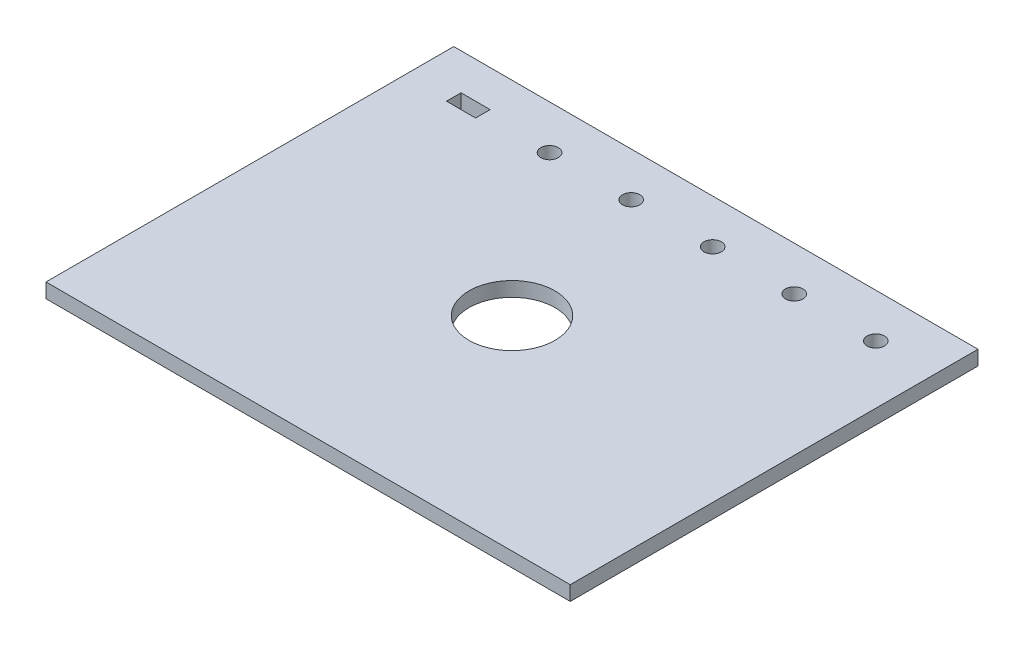
ISO-10303-21;
HEADER;
FILE_DESCRIPTION(('STEP AP214'),'2;1');
FILE_NAME('part.step','',(''),(''),'','','');
FILE_SCHEMA(('AUTOMOTIVE_DESIGN { 1 0 10303 214 1 1 1 1 }'));
ENDSEC;
DATA;
#1=APPLICATION_CONTEXT('core data for automotive mechanical design processes');
#2=APPLICATION_PROTOCOL_DEFINITION('international standard','automotive_design',2000,#1);
#3=PRODUCT_CONTEXT('',#1,'mechanical');
#4=PRODUCT('Part','Part','',(#3));
#5=PRODUCT_RELATED_PRODUCT_CATEGORY('part','',(#4));
#6=PRODUCT_DEFINITION_FORMATION('','',#4);
#7=PRODUCT_DEFINITION_CONTEXT('part definition',#1,'design');
#8=PRODUCT_DEFINITION('design','',#6,#7);
#9=PRODUCT_DEFINITION_SHAPE('','',#8);
#10=(LENGTH_UNIT() NAMED_UNIT(*) SI_UNIT(.MILLI.,.METRE.));
#11=(NAMED_UNIT(*) PLANE_ANGLE_UNIT() SI_UNIT($,.RADIAN.));
#12=(NAMED_UNIT(*) SI_UNIT($,.STERADIAN.) SOLID_ANGLE_UNIT());
#13=UNCERTAINTY_MEASURE_WITH_UNIT(LENGTH_MEASURE(1.E-05),#10,'distance_accuracy_value','');
#14=(GEOMETRIC_REPRESENTATION_CONTEXT(3) GLOBAL_UNCERTAINTY_ASSIGNED_CONTEXT((#13)) GLOBAL_UNIT_ASSIGNED_CONTEXT((#10,
#11,#12)) REPRESENTATION_CONTEXT('',''));
#15=CARTESIAN_POINT('',(0.,0.,0.));
#16=DIRECTION('',(0.,0.,1.));
#17=DIRECTION('',(1.,0.,0.));
#18=AXIS2_PLACEMENT_3D('',#15,#16,#17);
#19=CARTESIAN_POINT('',(0.,5.,0.));
#20=DIRECTION('',(0.,-1.,0.));
#21=DIRECTION('',(0.,0.,-1.));
#22=AXIS2_PLACEMENT_3D('',#19,#20,#21);
#23=PLANE('',#22);
#24=CARTESIAN_POINT('',(-42.,5.,-54.8950795947902));
#25=DIRECTION('',(0.,1.,0.));
#26=DIRECTION('',(0.,0.,1.));
#27=AXIS2_PLACEMENT_3D('',#24,#25,#26);
#28=CIRCLE('',#27,3.);
#29=CARTESIAN_POINT('',(-42.,5.,-51.8950795947902));
#30=VERTEX_POINT('',#29);
#31=EDGE_CURVE('E134',#30,#30,#28,.T.);
#32=ORIENTED_EDGE('',*,*,#31,.F.);
#33=EDGE_LOOP('',(#32));
#34=FACE_BOUND('',#33,.T.);
#35=CARTESIAN_POINT('',(-14.,5.,-54.8950795947902));
#36=DIRECTION('',(0.,1.,0.));
#37=DIRECTION('',(0.,0.,1.));
#38=AXIS2_PLACEMENT_3D('',#35,#36,#37);
#39=CIRCLE('',#38,3.);
#40=CARTESIAN_POINT('',(-14.,5.,-51.8950795947902));
#41=VERTEX_POINT('',#40);
#42=EDGE_CURVE('E140',#41,#41,#39,.T.);
#43=ORIENTED_EDGE('',*,*,#42,.F.);
#44=EDGE_LOOP('',(#43));
#45=FACE_BOUND('',#44,.T.);
#46=CARTESIAN_POINT('',(14.,5.,-54.8950795947902));
#47=DIRECTION('',(0.,1.,0.));
#48=DIRECTION('',(0.,0.,1.));
#49=AXIS2_PLACEMENT_3D('',#46,#47,#48);
#50=CIRCLE('',#49,3.);
#51=CARTESIAN_POINT('',(14.,5.,-51.8950795947902));
#52=VERTEX_POINT('',#51);
#53=EDGE_CURVE('E146',#52,#52,#50,.T.);
#54=ORIENTED_EDGE('',*,*,#53,.F.);
#55=EDGE_LOOP('',(#54));
#56=FACE_BOUND('',#55,.T.);
#57=CARTESIAN_POINT('',(42.,5.,-54.8950795947903));
#58=DIRECTION('',(0.,1.,0.));
#59=DIRECTION('',(0.,0.,1.));
#60=AXIS2_PLACEMENT_3D('',#57,#58,#59);
#61=CIRCLE('',#60,3.);
#62=CARTESIAN_POINT('',(42.,5.,-51.8950795947903));
#63=VERTEX_POINT('',#62);
#64=EDGE_CURVE('E152',#63,#63,#61,.T.);
#65=ORIENTED_EDGE('',*,*,#64,.F.);
#66=EDGE_LOOP('',(#65));
#67=FACE_BOUND('',#66,.T.);
#68=CARTESIAN_POINT('',(70.,5.,-54.8950795947903));
#69=DIRECTION('',(0.,1.,0.));
#70=DIRECTION('',(0.,0.,1.));
#71=AXIS2_PLACEMENT_3D('',#68,#69,#70);
#72=CIRCLE('',#71,3.00000000000001);
#73=CARTESIAN_POINT('',(70.,5.,-51.8950795947903));
#74=VERTEX_POINT('',#73);
#75=EDGE_CURVE('E158',#74,#74,#72,.T.);
#76=ORIENTED_EDGE('',*,*,#75,.F.);
#77=EDGE_LOOP('',(#76));
#78=FACE_BOUND('',#77,.T.);
#79=CARTESIAN_POINT('',(0.,5.,0.));
#80=DIRECTION('',(0.,1.,0.));
#81=DIRECTION('',(0.,0.,1.));
#82=AXIS2_PLACEMENT_3D('',#79,#80,#81);
#83=CIRCLE('',#82,14.75);
#84=CARTESIAN_POINT('',(0.,5.,14.75));
#85=VERTEX_POINT('',#84);
#86=EDGE_CURVE('E164',#85,#85,#83,.T.);
#87=ORIENTED_EDGE('',*,*,#86,.F.);
#88=EDGE_LOOP('',(#87));
#89=FACE_BOUND('',#88,.T.);
#90=DIRECTION('',(0.,0.,-1.));
#91=VECTOR('',#90,1.);
#92=CARTESIAN_POINT('',(90.,5.,70.));
#93=LINE('',#92,#91);
#94=CARTESIAN_POINT('',(90.,5.,70.));
#95=VERTEX_POINT('',#94);
#96=CARTESIAN_POINT('',(90.,5.,-70.));
#97=VERTEX_POINT('',#96);
#98=EDGE_CURVE('E170',#95,#97,#93,.T.);
#99=ORIENTED_EDGE('',*,*,#98,.T.);
#100=DIRECTION('',(-1.,0.,0.));
#101=VECTOR('',#100,1.);
#102=CARTESIAN_POINT('',(-90.,5.,-70.));
#103=LINE('',#102,#101);
#104=CARTESIAN_POINT('',(-90.,5.,-70.));
#105=VERTEX_POINT('',#104);
#106=EDGE_CURVE('E173',#97,#105,#103,.T.);
#107=ORIENTED_EDGE('',*,*,#106,.T.);
#108=DIRECTION('',(0.,0.,1.));
#109=VECTOR('',#108,1.);
#110=CARTESIAN_POINT('',(-90.,5.,70.));
#111=LINE('',#110,#109);
#112=CARTESIAN_POINT('',(-90.,5.,70.));
#113=VERTEX_POINT('',#112);
#114=EDGE_CURVE('E176',#105,#113,#111,.T.);
#115=ORIENTED_EDGE('',*,*,#114,.T.);
#116=DIRECTION('',(1.,0.,0.));
#117=VECTOR('',#116,1.);
#118=CARTESIAN_POINT('',(-90.,5.,70.));
#119=LINE('',#118,#117);
#120=EDGE_CURVE('E178',#113,#95,#119,.T.);
#121=ORIENTED_EDGE('',*,*,#120,.T.);
#122=EDGE_LOOP('',(#99,#107,#115,#121));
#123=FACE_BOUND('',#122,.T.);
#124=DIRECTION('',(0.,0.,1.));
#125=VECTOR('',#124,1.);
#126=CARTESIAN_POINT('',(-75.,5.,-52.5));
#127=LINE('',#126,#125);
#128=CARTESIAN_POINT('',(-75.,5.,-57.5));
#129=VERTEX_POINT('',#128);
#130=CARTESIAN_POINT('',(-75.,5.,-52.5));
#131=VERTEX_POINT('',#130);
#132=EDGE_CURVE('E98',#129,#131,#127,.T.);
#133=ORIENTED_EDGE('',*,*,#132,.F.);
#134=DIRECTION('',(-1.,0.,0.));
#135=VECTOR('',#134,1.);
#136=CARTESIAN_POINT('',(-65.,5.,-57.5));
#137=LINE('',#136,#135);
#138=CARTESIAN_POINT('',(-65.,5.,-57.5));
#139=VERTEX_POINT('',#138);
#140=EDGE_CURVE('E120',#139,#129,#137,.T.);
#141=ORIENTED_EDGE('',*,*,#140,.F.);
#142=DIRECTION('',(0.,0.,-1.));
#143=VECTOR('',#142,1.);
#144=CARTESIAN_POINT('',(-65.,5.,-52.5));
#145=LINE('',#144,#143);
#146=CARTESIAN_POINT('',(-65.,5.,-52.5));
#147=VERTEX_POINT('',#146);
#148=EDGE_CURVE('E118',#147,#139,#145,.T.);
#149=ORIENTED_EDGE('',*,*,#148,.F.);
#150=DIRECTION('',(1.,0.,0.));
#151=VECTOR('',#150,1.);
#152=CARTESIAN_POINT('',(-65.,5.,-52.5));
#153=LINE('',#152,#151);
#154=EDGE_CURVE('E106',#131,#147,#153,.T.);
#155=ORIENTED_EDGE('',*,*,#154,.F.);
#156=EDGE_LOOP('',(#133,#141,#149,#155));
#157=FACE_BOUND('',#156,.T.);
#158=ADVANCED_FACE('F33',(#34,#45,#56,#67,#78,#89,#123,#157),#23,.F.);
#159=CARTESIAN_POINT('',(0.,0.,0.));
#160=DIRECTION('',(0.,-1.,0.));
#161=DIRECTION('',(0.,0.,-1.));
#162=AXIS2_PLACEMENT_3D('',#159,#160,#161);
#163=PLANE('',#162);
#164=CARTESIAN_POINT('',(-14.,0.,-54.8950795947902));
#165=DIRECTION('',(0.,1.,0.));
#166=DIRECTION('',(0.,0.,1.));
#167=AXIS2_PLACEMENT_3D('',#164,#165,#166);
#168=CIRCLE('',#167,3.);
#169=CARTESIAN_POINT('',(-14.,0.,-51.8950795947902));
#170=VERTEX_POINT('',#169);
#171=EDGE_CURVE('E137',#170,#170,#168,.T.);
#172=ORIENTED_EDGE('',*,*,#171,.T.);
#173=EDGE_LOOP('',(#172));
#174=FACE_BOUND('',#173,.T.);
#175=CARTESIAN_POINT('',(42.,0.,-54.8950795947903));
#176=DIRECTION('',(0.,1.,0.));
#177=DIRECTION('',(0.,0.,1.));
#178=AXIS2_PLACEMENT_3D('',#175,#176,#177);
#179=CIRCLE('',#178,3.);
#180=CARTESIAN_POINT('',(42.,0.,-51.8950795947903));
#181=VERTEX_POINT('',#180);
#182=EDGE_CURVE('E149',#181,#181,#179,.T.);
#183=ORIENTED_EDGE('',*,*,#182,.T.);
#184=EDGE_LOOP('',(#183));
#185=FACE_BOUND('',#184,.T.);
#186=CARTESIAN_POINT('',(0.,0.,0.));
#187=DIRECTION('',(0.,1.,0.));
#188=DIRECTION('',(0.,0.,1.));
#189=AXIS2_PLACEMENT_3D('',#186,#187,#188);
#190=CIRCLE('',#189,14.75);
#191=CARTESIAN_POINT('',(0.,0.,14.75));
#192=VERTEX_POINT('',#191);
#193=EDGE_CURVE('E161',#192,#192,#190,.T.);
#194=ORIENTED_EDGE('',*,*,#193,.T.);
#195=EDGE_LOOP('',(#194));
#196=FACE_BOUND('',#195,.T.);
#197=DIRECTION('',(0.,0.,-1.));
#198=VECTOR('',#197,1.);
#199=CARTESIAN_POINT('',(90.,0.,70.));
#200=LINE('',#199,#198);
#201=CARTESIAN_POINT('',(90.,0.,70.));
#202=VERTEX_POINT('',#201);
#203=CARTESIAN_POINT('',(90.,0.,-70.));
#204=VERTEX_POINT('',#203);
#205=EDGE_CURVE('E167',#202,#204,#200,.T.);
#206=ORIENTED_EDGE('',*,*,#205,.F.);
#207=DIRECTION('',(1.,0.,0.));
#208=VECTOR('',#207,1.);
#209=CARTESIAN_POINT('',(-90.,0.,70.));
#210=LINE('',#209,#208);
#211=CARTESIAN_POINT('',(-90.,0.,70.));
#212=VERTEX_POINT('',#211);
#213=EDGE_CURVE('E174',#212,#202,#210,.T.);
#214=ORIENTED_EDGE('',*,*,#213,.F.);
#215=DIRECTION('',(0.,0.,1.));
#216=VECTOR('',#215,1.);
#217=CARTESIAN_POINT('',(-90.,0.,70.));
#218=LINE('',#217,#216);
#219=CARTESIAN_POINT('',(-90.,0.,-70.));
#220=VERTEX_POINT('',#219);
#221=EDGE_CURVE('E185',#220,#212,#218,.T.);
#222=ORIENTED_EDGE('',*,*,#221,.F.);
#223=DIRECTION('',(-1.,0.,0.));
#224=VECTOR('',#223,1.);
#225=CARTESIAN_POINT('',(-90.,0.,-70.));
#226=LINE('',#225,#224);
#227=EDGE_CURVE('E183',#204,#220,#226,.T.);
#228=ORIENTED_EDGE('',*,*,#227,.F.);
#229=EDGE_LOOP('',(#206,#214,#222,#228));
#230=FACE_BOUND('',#229,.T.);
#231=CARTESIAN_POINT('',(70.,0.,-54.8950795947903));
#232=DIRECTION('',(0.,1.,0.));
#233=DIRECTION('',(0.,0.,1.));
#234=AXIS2_PLACEMENT_3D('',#231,#232,#233);
#235=CIRCLE('',#234,3.00000000000001);
#236=CARTESIAN_POINT('',(70.,0.,-51.8950795947903));
#237=VERTEX_POINT('',#236);
#238=EDGE_CURVE('E155',#237,#237,#235,.T.);
#239=ORIENTED_EDGE('',*,*,#238,.T.);
#240=EDGE_LOOP('',(#239));
#241=FACE_BOUND('',#240,.T.);
#242=CARTESIAN_POINT('',(14.,0.,-54.8950795947902));
#243=DIRECTION('',(0.,1.,0.));
#244=DIRECTION('',(0.,0.,1.));
#245=AXIS2_PLACEMENT_3D('',#242,#243,#244);
#246=CIRCLE('',#245,3.);
#247=CARTESIAN_POINT('',(14.,0.,-51.8950795947902));
#248=VERTEX_POINT('',#247);
#249=EDGE_CURVE('E143',#248,#248,#246,.T.);
#250=ORIENTED_EDGE('',*,*,#249,.T.);
#251=EDGE_LOOP('',(#250));
#252=FACE_BOUND('',#251,.T.);
#253=CARTESIAN_POINT('',(-42.,0.,-54.8950795947902));
#254=DIRECTION('',(0.,1.,0.));
#255=DIRECTION('',(0.,0.,1.));
#256=AXIS2_PLACEMENT_3D('',#253,#254,#255);
#257=CIRCLE('',#256,3.);
#258=CARTESIAN_POINT('',(-42.,0.,-51.8950795947902));
#259=VERTEX_POINT('',#258);
#260=EDGE_CURVE('E114',#259,#259,#257,.T.);
#261=ORIENTED_EDGE('',*,*,#260,.T.);
#262=EDGE_LOOP('',(#261));
#263=FACE_BOUND('',#262,.T.);
#264=DIRECTION('',(-1.,0.,0.));
#265=VECTOR('',#264,1.);
#266=CARTESIAN_POINT('',(-65.,0.,-57.5));
#267=LINE('',#266,#265);
#268=CARTESIAN_POINT('',(-65.,0.,-57.5));
#269=VERTEX_POINT('',#268);
#270=CARTESIAN_POINT('',(-75.,0.,-57.5));
#271=VERTEX_POINT('',#270);
#272=EDGE_CURVE('E107',#269,#271,#267,.T.);
#273=ORIENTED_EDGE('',*,*,#272,.T.);
#274=DIRECTION('',(0.,0.,1.));
#275=VECTOR('',#274,1.);
#276=CARTESIAN_POINT('',(-75.,0.,-52.5));
#277=LINE('',#276,#275);
#278=CARTESIAN_POINT('',(-75.,0.,-52.5));
#279=VERTEX_POINT('',#278);
#280=EDGE_CURVE('E56',#271,#279,#277,.T.);
#281=ORIENTED_EDGE('',*,*,#280,.T.);
#282=DIRECTION('',(1.,0.,0.));
#283=VECTOR('',#282,1.);
#284=CARTESIAN_POINT('',(-65.,0.,-52.5));
#285=LINE('',#284,#283);
#286=CARTESIAN_POINT('',(-65.,0.,-52.5));
#287=VERTEX_POINT('',#286);
#288=EDGE_CURVE('E113',#279,#287,#285,.T.);
#289=ORIENTED_EDGE('',*,*,#288,.T.);
#290=DIRECTION('',(0.,0.,-1.));
#291=VECTOR('',#290,1.);
#292=CARTESIAN_POINT('',(-65.,0.,-52.5));
#293=LINE('',#292,#291);
#294=EDGE_CURVE('E126',#287,#269,#293,.T.);
#295=ORIENTED_EDGE('',*,*,#294,.T.);
#296=EDGE_LOOP('',(#273,#281,#289,#295));
#297=FACE_BOUND('',#296,.T.);
#298=ADVANCED_FACE('F203',(#174,#185,#196,#230,#241,#252,#263,#297),#163,.T.);
#299=CARTESIAN_POINT('',(90.,5.,70.));
#300=DIRECTION('',(-1.,0.,0.));
#301=DIRECTION('',(0.,0.,1.));
#302=AXIS2_PLACEMENT_3D('',#299,#300,#301);
#303=PLANE('',#302);
#304=ORIENTED_EDGE('',*,*,#205,.T.);
#305=DIRECTION('',(0.,-1.,0.));
#306=VECTOR('',#305,1.);
#307=CARTESIAN_POINT('',(90.,5.,-70.));
#308=LINE('',#307,#306);
#309=EDGE_CURVE('E11',#97,#204,#308,.T.);
#310=ORIENTED_EDGE('',*,*,#309,.F.);
#311=ORIENTED_EDGE('',*,*,#98,.F.);
#312=DIRECTION('',(0.,-1.,0.));
#313=VECTOR('',#312,1.);
#314=CARTESIAN_POINT('',(90.,5.,70.));
#315=LINE('',#314,#313);
#316=EDGE_CURVE('E180',#95,#202,#315,.T.);
#317=ORIENTED_EDGE('',*,*,#316,.T.);
#318=EDGE_LOOP('',(#304,#310,#311,#317));
#319=FACE_BOUND('',#318,.T.);
#320=ADVANCED_FACE('F35',(#319),#303,.F.);
#321=CARTESIAN_POINT('',(-90.,5.,-70.));
#322=DIRECTION('',(0.,0.,1.));
#323=DIRECTION('',(1.,0.,0.));
#324=AXIS2_PLACEMENT_3D('',#321,#322,#323);
#325=PLANE('',#324);
#326=ORIENTED_EDGE('',*,*,#227,.T.);
#327=DIRECTION('',(0.,-1.,0.));
#328=VECTOR('',#327,1.);
#329=CARTESIAN_POINT('',(-90.,5.,-70.));
#330=LINE('',#329,#328);
#331=EDGE_CURVE('E41',#105,#220,#330,.T.);
#332=ORIENTED_EDGE('',*,*,#331,.F.);
#333=ORIENTED_EDGE('',*,*,#106,.F.);
#334=ORIENTED_EDGE('',*,*,#309,.T.);
#335=EDGE_LOOP('',(#326,#332,#333,#334));
#336=FACE_BOUND('',#335,.T.);
#337=ADVANCED_FACE('F213',(#336),#325,.F.);
#338=CARTESIAN_POINT('',(-90.,5.,70.));
#339=DIRECTION('',(1.,0.,0.));
#340=DIRECTION('',(0.,0.,-1.));
#341=AXIS2_PLACEMENT_3D('',#338,#339,#340);
#342=PLANE('',#341);
#343=ORIENTED_EDGE('',*,*,#221,.T.);
#344=DIRECTION('',(0.,-1.,0.));
#345=VECTOR('',#344,1.);
#346=CARTESIAN_POINT('',(-90.,5.,70.));
#347=LINE('',#346,#345);
#348=EDGE_CURVE('E190',#113,#212,#347,.T.);
#349=ORIENTED_EDGE('',*,*,#348,.F.);
#350=ORIENTED_EDGE('',*,*,#114,.F.);
#351=ORIENTED_EDGE('',*,*,#331,.T.);
#352=EDGE_LOOP('',(#343,#349,#350,#351));
#353=FACE_BOUND('',#352,.T.);
#354=ADVANCED_FACE('F197',(#353),#342,.F.);
#355=CARTESIAN_POINT('',(-90.,5.,70.));
#356=DIRECTION('',(0.,0.,-1.));
#357=DIRECTION('',(-1.,0.,0.));
#358=AXIS2_PLACEMENT_3D('',#355,#356,#357);
#359=PLANE('',#358);
#360=ORIENTED_EDGE('',*,*,#213,.T.);
#361=ORIENTED_EDGE('',*,*,#316,.F.);
#362=ORIENTED_EDGE('',*,*,#120,.F.);
#363=ORIENTED_EDGE('',*,*,#348,.T.);
#364=EDGE_LOOP('',(#360,#361,#362,#363));
#365=FACE_BOUND('',#364,.T.);
#366=ADVANCED_FACE('F207',(#365),#359,.F.);
#367=CARTESIAN_POINT('',(0.,5.,0.));
#368=DIRECTION('',(0.,-1.,0.));
#369=DIRECTION('',(0.,0.,-1.));
#370=AXIS2_PLACEMENT_3D('',#367,#368,#369);
#371=CYLINDRICAL_SURFACE('',#370,14.75);
#372=ORIENTED_EDGE('',*,*,#86,.T.);
#373=EDGE_LOOP('',(#372));
#374=FACE_BOUND('',#373,.T.);
#375=ORIENTED_EDGE('',*,*,#193,.F.);
#376=EDGE_LOOP('',(#375));
#377=FACE_BOUND('',#376,.T.);
#378=ADVANCED_FACE('F231',(#374,#377),#371,.F.);
#379=CARTESIAN_POINT('',(70.,5.,-54.8950795947903));
#380=DIRECTION('',(0.,-1.,0.));
#381=DIRECTION('',(0.,0.,-1.));
#382=AXIS2_PLACEMENT_3D('',#379,#380,#381);
#383=CYLINDRICAL_SURFACE('',#382,3.00000000000001);
#384=ORIENTED_EDGE('',*,*,#75,.T.);
#385=EDGE_LOOP('',(#384));
#386=FACE_BOUND('',#385,.T.);
#387=ORIENTED_EDGE('',*,*,#238,.F.);
#388=EDGE_LOOP('',(#387));
#389=FACE_BOUND('',#388,.T.);
#390=ADVANCED_FACE('F238',(#386,#389),#383,.F.);
#391=CARTESIAN_POINT('',(42.,5.,-54.8950795947903));
#392=DIRECTION('',(0.,-1.,0.));
#393=DIRECTION('',(0.,0.,-1.));
#394=AXIS2_PLACEMENT_3D('',#391,#392,#393);
#395=CYLINDRICAL_SURFACE('',#394,3.);
#396=ORIENTED_EDGE('',*,*,#64,.T.);
#397=EDGE_LOOP('',(#396));
#398=FACE_BOUND('',#397,.T.);
#399=ORIENTED_EDGE('',*,*,#182,.F.);
#400=EDGE_LOOP('',(#399));
#401=FACE_BOUND('',#400,.T.);
#402=ADVANCED_FACE('F243',(#398,#401),#395,.F.);
#403=CARTESIAN_POINT('',(14.,5.,-54.8950795947902));
#404=DIRECTION('',(0.,-1.,0.));
#405=DIRECTION('',(0.,0.,-1.));
#406=AXIS2_PLACEMENT_3D('',#403,#404,#405);
#407=CYLINDRICAL_SURFACE('',#406,3.);
#408=ORIENTED_EDGE('',*,*,#53,.T.);
#409=EDGE_LOOP('',(#408));
#410=FACE_BOUND('',#409,.T.);
#411=ORIENTED_EDGE('',*,*,#249,.F.);
#412=EDGE_LOOP('',(#411));
#413=FACE_BOUND('',#412,.T.);
#414=ADVANCED_FACE('F253',(#410,#413),#407,.F.);
#415=CARTESIAN_POINT('',(-14.,5.,-54.8950795947902));
#416=DIRECTION('',(0.,-1.,0.));
#417=DIRECTION('',(0.,0.,-1.));
#418=AXIS2_PLACEMENT_3D('',#415,#416,#417);
#419=CYLINDRICAL_SURFACE('',#418,3.);
#420=ORIENTED_EDGE('',*,*,#42,.T.);
#421=EDGE_LOOP('',(#420));
#422=FACE_BOUND('',#421,.T.);
#423=ORIENTED_EDGE('',*,*,#171,.F.);
#424=EDGE_LOOP('',(#423));
#425=FACE_BOUND('',#424,.T.);
#426=ADVANCED_FACE('F260',(#422,#425),#419,.F.);
#427=CARTESIAN_POINT('',(-42.,5.,-54.8950795947902));
#428=DIRECTION('',(0.,-1.,0.));
#429=DIRECTION('',(0.,0.,-1.));
#430=AXIS2_PLACEMENT_3D('',#427,#428,#429);
#431=CYLINDRICAL_SURFACE('',#430,3.);
#432=ORIENTED_EDGE('',*,*,#31,.T.);
#433=EDGE_LOOP('',(#432));
#434=FACE_BOUND('',#433,.T.);
#435=ORIENTED_EDGE('',*,*,#260,.F.);
#436=EDGE_LOOP('',(#435));
#437=FACE_BOUND('',#436,.T.);
#438=ADVANCED_FACE('F264',(#434,#437),#431,.F.);
#439=CARTESIAN_POINT('',(-75.,5.,-52.5));
#440=DIRECTION('',(1.,0.,0.));
#441=DIRECTION('',(0.,0.,-1.));
#442=AXIS2_PLACEMENT_3D('',#439,#440,#441);
#443=PLANE('',#442);
#444=ORIENTED_EDGE('',*,*,#280,.F.);
#445=DIRECTION('',(0.,-1.,0.));
#446=VECTOR('',#445,1.);
#447=CARTESIAN_POINT('',(-75.,5.,-57.5));
#448=LINE('',#447,#446);
#449=EDGE_CURVE('E102',#129,#271,#448,.T.);
#450=ORIENTED_EDGE('',*,*,#449,.F.);
#451=ORIENTED_EDGE('',*,*,#132,.T.);
#452=DIRECTION('',(0.,-1.,0.));
#453=VECTOR('',#452,1.);
#454=CARTESIAN_POINT('',(-75.,5.,-52.5));
#455=LINE('',#454,#453);
#456=EDGE_CURVE('E101',#131,#279,#455,.T.);
#457=ORIENTED_EDGE('',*,*,#456,.T.);
#458=EDGE_LOOP('',(#444,#450,#451,#457));
#459=FACE_BOUND('',#458,.T.);
#460=ADVANCED_FACE('F100',(#459),#443,.T.);
#461=CARTESIAN_POINT('',(-65.,5.,-52.5));
#462=DIRECTION('',(0.,0.,-1.));
#463=DIRECTION('',(-1.,0.,0.));
#464=AXIS2_PLACEMENT_3D('',#461,#462,#463);
#465=PLANE('',#464);
#466=ORIENTED_EDGE('',*,*,#288,.F.);
#467=ORIENTED_EDGE('',*,*,#456,.F.);
#468=ORIENTED_EDGE('',*,*,#154,.T.);
#469=DIRECTION('',(0.,-1.,0.));
#470=VECTOR('',#469,1.);
#471=CARTESIAN_POINT('',(-65.,5.,-52.5));
#472=LINE('',#471,#470);
#473=EDGE_CURVE('E115',#147,#287,#472,.T.);
#474=ORIENTED_EDGE('',*,*,#473,.T.);
#475=EDGE_LOOP('',(#466,#467,#468,#474));
#476=FACE_BOUND('',#475,.T.);
#477=ADVANCED_FACE('F110',(#476),#465,.T.);
#478=CARTESIAN_POINT('',(-65.,5.,-52.5));
#479=DIRECTION('',(-1.,0.,0.));
#480=DIRECTION('',(0.,0.,1.));
#481=AXIS2_PLACEMENT_3D('',#478,#479,#480);
#482=PLANE('',#481);
#483=ORIENTED_EDGE('',*,*,#294,.F.);
#484=ORIENTED_EDGE('',*,*,#473,.F.);
#485=ORIENTED_EDGE('',*,*,#148,.T.);
#486=DIRECTION('',(0.,-1.,0.));
#487=VECTOR('',#486,1.);
#488=CARTESIAN_POINT('',(-65.,5.,-57.5));
#489=LINE('',#488,#487);
#490=EDGE_CURVE('E48',#139,#269,#489,.T.);
#491=ORIENTED_EDGE('',*,*,#490,.T.);
#492=EDGE_LOOP('',(#483,#484,#485,#491));
#493=FACE_BOUND('',#492,.T.);
#494=ADVANCED_FACE('F273',(#493),#482,.T.);
#495=CARTESIAN_POINT('',(-65.,5.,-57.5));
#496=DIRECTION('',(0.,0.,1.));
#497=DIRECTION('',(1.,0.,0.));
#498=AXIS2_PLACEMENT_3D('',#495,#496,#497);
#499=PLANE('',#498);
#500=ORIENTED_EDGE('',*,*,#272,.F.);
#501=ORIENTED_EDGE('',*,*,#490,.F.);
#502=ORIENTED_EDGE('',*,*,#140,.T.);
#503=ORIENTED_EDGE('',*,*,#449,.T.);
#504=EDGE_LOOP('',(#500,#501,#502,#503));
#505=FACE_BOUND('',#504,.T.);
#506=ADVANCED_FACE('F276',(#505),#499,.T.);
#507=CLOSED_SHELL('',(#158,#298,#320,#337,#354,#366,#378,#390,#402,#414,#426,#438,#460,#477,
#494,#506));
#508=MANIFOLD_SOLID_BREP('B2',#507);
#509=ADVANCED_BREP_SHAPE_REPRESENTATION('',(#18,#508),#14);
#510=SHAPE_DEFINITION_REPRESENTATION(#9,#509);
ENDSEC;
END-ISO-10303-21;
